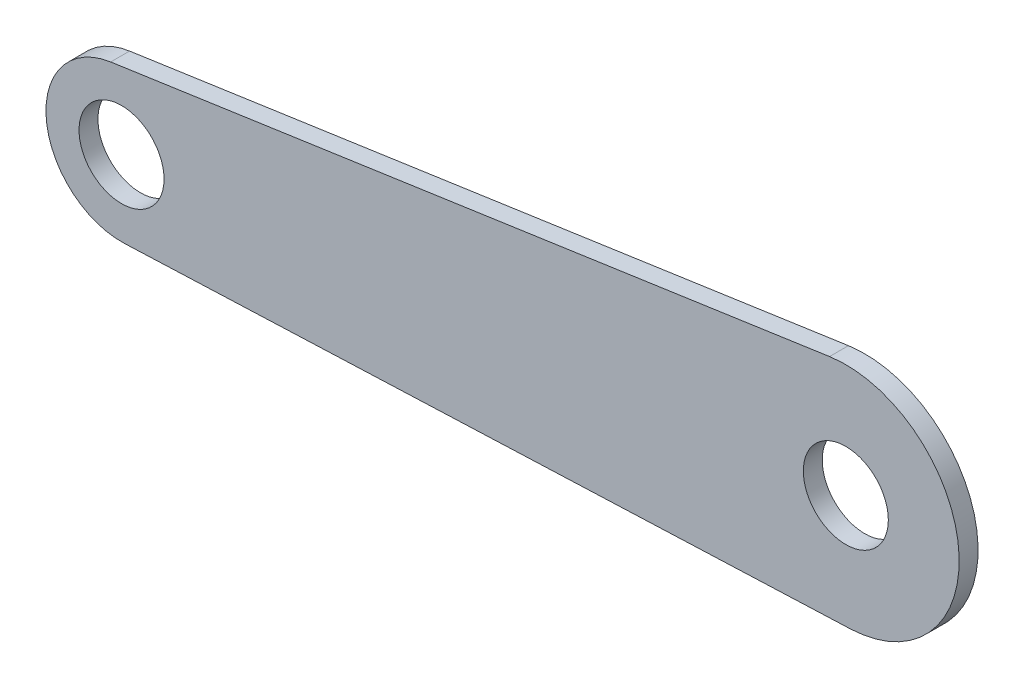
ISO-10303-21;
HEADER;
FILE_DESCRIPTION(('STEP AP214'),'2;1');
FILE_NAME('part.step','',(''),(''),'','','');
FILE_SCHEMA(('AUTOMOTIVE_DESIGN { 1 0 10303 214 1 1 1 1 }'));
ENDSEC;
DATA;
#1=APPLICATION_CONTEXT('core data for automotive mechanical design processes');
#2=APPLICATION_PROTOCOL_DEFINITION('international standard','automotive_design',2000,#1);
#3=PRODUCT_CONTEXT('',#1,'mechanical');
#4=PRODUCT('Part','Part','',(#3));
#5=PRODUCT_RELATED_PRODUCT_CATEGORY('part','',(#4));
#6=PRODUCT_DEFINITION_FORMATION('','',#4);
#7=PRODUCT_DEFINITION_CONTEXT('part definition',#1,'design');
#8=PRODUCT_DEFINITION('design','',#6,#7);
#9=PRODUCT_DEFINITION_SHAPE('','',#8);
#10=(LENGTH_UNIT() NAMED_UNIT(*) SI_UNIT(.MILLI.,.METRE.));
#11=(NAMED_UNIT(*) PLANE_ANGLE_UNIT() SI_UNIT($,.RADIAN.));
#12=(NAMED_UNIT(*) SI_UNIT($,.STERADIAN.) SOLID_ANGLE_UNIT());
#13=UNCERTAINTY_MEASURE_WITH_UNIT(LENGTH_MEASURE(1.E-05),#10,'distance_accuracy_value','');
#14=(GEOMETRIC_REPRESENTATION_CONTEXT(3) GLOBAL_UNCERTAINTY_ASSIGNED_CONTEXT((#13)) GLOBAL_UNIT_ASSIGNED_CONTEXT((#10,
#11,#12)) REPRESENTATION_CONTEXT('',''));
#15=CARTESIAN_POINT('',(0.,0.,0.));
#16=DIRECTION('',(0.,0.,1.));
#17=DIRECTION('',(1.,0.,0.));
#18=AXIS2_PLACEMENT_3D('',#15,#16,#17);
#19=CARTESIAN_POINT('',(158.75,246.126,6.35));
#20=DIRECTION('',(0.,0.,-1.));
#21=DIRECTION('',(-1.,0.,0.));
#22=AXIS2_PLACEMENT_3D('',#19,#20,#21);
#23=CYLINDRICAL_SURFACE('',#22,38.1000000000001);
#24=CARTESIAN_POINT('',(158.75,246.126,0.));
#25=DIRECTION('',(0.,0.,1.));
#26=DIRECTION('',(1.,0.,0.));
#27=AXIS2_PLACEMENT_3D('',#24,#25,#26);
#28=CIRCLE('',#27,38.1000000000001);
#29=CARTESIAN_POINT('',(160.278782763725,208.056683966463,0.));
#30=VERTEX_POINT('',#29);
#31=CARTESIAN_POINT('',(153.279443351109,283.831211973297,0.));
#32=VERTEX_POINT('',#31);
#33=EDGE_CURVE('E114',#30,#32,#28,.T.);
#34=ORIENTED_EDGE('',*,*,#33,.T.);
#35=DIRECTION('',(0.,0.,-1.));
#36=VECTOR('',#35,1.);
#37=CARTESIAN_POINT('',(153.279443351109,283.831211973297,6.35));
#38=LINE('',#37,#36);
#39=CARTESIAN_POINT('',(153.279443351109,283.831211973297,6.35));
#40=VERTEX_POINT('',#39);
#41=EDGE_CURVE('E11',#40,#32,#38,.T.);
#42=ORIENTED_EDGE('',*,*,#41,.F.);
#43=CARTESIAN_POINT('',(158.75,246.126,6.35));
#44=DIRECTION('',(0.,0.,1.));
#45=DIRECTION('',(1.,0.,0.));
#46=AXIS2_PLACEMENT_3D('',#43,#44,#45);
#47=CIRCLE('',#46,38.1000000000001);
#48=CARTESIAN_POINT('',(160.278782763725,208.056683966463,6.35));
#49=VERTEX_POINT('',#48);
#50=EDGE_CURVE('E84',#49,#40,#47,.T.);
#51=ORIENTED_EDGE('',*,*,#50,.F.);
#52=DIRECTION('',(0.,0.,-1.));
#53=VECTOR('',#52,1.);
#54=CARTESIAN_POINT('',(160.278782763725,208.056683966463,6.35));
#55=LINE('',#54,#53);
#56=EDGE_CURVE('E110',#49,#30,#55,.T.);
#57=ORIENTED_EDGE('',*,*,#56,.T.);
#58=EDGE_LOOP('',(#34,#42,#51,#57));
#59=FACE_BOUND('',#58,.T.);
#60=ADVANCED_FACE('F41',(#59),#23,.T.);
#61=CARTESIAN_POINT('',(-37.1713100763805,256.199179664689,6.35));
#62=DIRECTION('',(-0.143584164012887,0.98963810953536,0.));
#63=DIRECTION('',(-0.98963810953536,-0.143584164012887,0.));
#64=AXIS2_PLACEMENT_3D('',#61,#62,#63);
#65=PLANE('',#64);
#66=DIRECTION('',(0.98963810953536,0.143584164012887,0.));
#67=VECTOR('',#66,1.);
#68=CARTESIAN_POINT('',(-37.1713100763805,256.199179664689,0.));
#69=LINE('',#68,#67);
#70=CARTESIAN_POINT('',(-88.3287533566649,248.776871797135,0.));
#71=VERTEX_POINT('',#70);
#72=EDGE_CURVE('E94',#71,#32,#69,.T.);
#73=ORIENTED_EDGE('',*,*,#72,.F.);
#74=DIRECTION('',(0.,0.,-1.));
#75=VECTOR('',#74,1.);
#76=CARTESIAN_POINT('',(-88.3287533566649,248.776871797135,6.35));
#77=LINE('',#76,#75);
#78=CARTESIAN_POINT('',(-88.3287533566649,248.776871797135,6.35));
#79=VERTEX_POINT('',#78);
#80=EDGE_CURVE('E50',#79,#71,#77,.T.);
#81=ORIENTED_EDGE('',*,*,#80,.F.);
#82=DIRECTION('',(0.98963810953536,0.143584164012887,0.));
#83=VECTOR('',#82,1.);
#84=CARTESIAN_POINT('',(-37.1713100763805,256.199179664689,6.35));
#85=LINE('',#84,#83);
#86=EDGE_CURVE('E92',#79,#40,#85,.T.);
#87=ORIENTED_EDGE('',*,*,#86,.T.);
#88=ORIENTED_EDGE('',*,*,#41,.T.);
#89=EDGE_LOOP('',(#73,#81,#87,#88));
#90=FACE_BOUND('',#89,.T.);
#91=ADVANCED_FACE('F91',(#90),#65,.T.);
#92=CARTESIAN_POINT('',(-84.6817155907376,223.640063814937,6.35));
#93=DIRECTION('',(0.,0.,-1.));
#94=DIRECTION('',(-1.,0.,0.));
#95=AXIS2_PLACEMENT_3D('',#92,#93,#94);
#96=CYLINDRICAL_SURFACE('',#95,25.4);
#97=CARTESIAN_POINT('',(-84.6817155907376,223.640063814937,0.));
#98=DIRECTION('',(0.,0.,1.));
#99=DIRECTION('',(1.,0.,0.));
#100=AXIS2_PLACEMENT_3D('',#97,#98,#99);
#101=CIRCLE('',#100,25.4);
#102=CARTESIAN_POINT('',(-83.6625270815875,198.260519792578,0.));
#103=VERTEX_POINT('',#102);
#104=EDGE_CURVE('E73',#71,#103,#101,.T.);
#105=ORIENTED_EDGE('',*,*,#104,.T.);
#106=DIRECTION('',(0.,0.,-1.));
#107=VECTOR('',#106,1.);
#108=CARTESIAN_POINT('',(-83.6625270815875,198.260519792578,6.35));
#109=LINE('',#108,#107);
#110=CARTESIAN_POINT('',(-83.6625270815875,198.260519792578,6.35));
#111=VERTEX_POINT('',#110);
#112=EDGE_CURVE('E95',#111,#103,#109,.T.);
#113=ORIENTED_EDGE('',*,*,#112,.F.);
#114=CARTESIAN_POINT('',(-84.6817155907376,223.640063814937,6.35));
#115=DIRECTION('',(0.,0.,1.));
#116=DIRECTION('',(1.,0.,0.));
#117=AXIS2_PLACEMENT_3D('',#114,#115,#116);
#118=CIRCLE('',#117,25.4);
#119=EDGE_CURVE('E96',#79,#111,#118,.T.);
#120=ORIENTED_EDGE('',*,*,#119,.F.);
#121=ORIENTED_EDGE('',*,*,#80,.T.);
#122=EDGE_LOOP('',(#105,#113,#120,#121));
#123=FACE_BOUND('',#122,.T.);
#124=ADVANCED_FACE('F97',(#123),#96,.T.);
#125=CARTESIAN_POINT('',(-8.08360351408128,201.295608617109,6.35));
#126=DIRECTION('',(-0.0401255318562997,0.999194646549534,0.));
#127=DIRECTION('',(-0.999194646549534,-0.0401255318562997,0.));
#128=AXIS2_PLACEMENT_3D('',#125,#126,#127);
#129=PLANE('',#128);
#130=DIRECTION('',(0.999194646549534,0.0401255318562997,0.));
#131=VECTOR('',#130,1.);
#132=CARTESIAN_POINT('',(-8.08360351408128,201.295608617109,0.));
#133=LINE('',#132,#131);
#134=EDGE_CURVE('E79',#103,#30,#133,.T.);
#135=ORIENTED_EDGE('',*,*,#134,.T.);
#136=ORIENTED_EDGE('',*,*,#56,.F.);
#137=DIRECTION('',(0.999194646549534,0.0401255318562997,0.));
#138=VECTOR('',#137,1.);
#139=CARTESIAN_POINT('',(-8.08360351408128,201.295608617109,6.35));
#140=LINE('',#139,#138);
#141=EDGE_CURVE('E58',#111,#49,#140,.T.);
#142=ORIENTED_EDGE('',*,*,#141,.F.);
#143=ORIENTED_EDGE('',*,*,#112,.T.);
#144=EDGE_LOOP('',(#135,#136,#142,#143));
#145=FACE_BOUND('',#144,.T.);
#146=ADVANCED_FACE('F124',(#145),#129,.F.);
#147=CARTESIAN_POINT('',(158.75,246.126,6.35));
#148=DIRECTION('',(0.,0.,-1.));
#149=DIRECTION('',(-1.,0.,0.));
#150=AXIS2_PLACEMENT_3D('',#147,#148,#149);
#151=CYLINDRICAL_SURFACE('',#150,14.2875);
#152=CARTESIAN_POINT('',(158.75,246.126,6.35));
#153=DIRECTION('',(0.,0.,1.));
#154=DIRECTION('',(1.,0.,0.));
#155=AXIS2_PLACEMENT_3D('',#152,#153,#154);
#156=CIRCLE('',#155,14.2875);
#157=CARTESIAN_POINT('',(173.0375,246.126,6.35));
#158=VERTEX_POINT('',#157);
#159=EDGE_CURVE('E102',#158,#158,#156,.T.);
#160=ORIENTED_EDGE('',*,*,#159,.T.);
#161=EDGE_LOOP('',(#160));
#162=FACE_BOUND('',#161,.T.);
#163=CARTESIAN_POINT('',(158.75,246.126,0.));
#164=DIRECTION('',(0.,0.,1.));
#165=DIRECTION('',(1.,0.,0.));
#166=AXIS2_PLACEMENT_3D('',#163,#164,#165);
#167=CIRCLE('',#166,14.2875);
#168=CARTESIAN_POINT('',(173.0375,246.126,0.));
#169=VERTEX_POINT('',#168);
#170=EDGE_CURVE('E111',#169,#169,#167,.T.);
#171=ORIENTED_EDGE('',*,*,#170,.F.);
#172=EDGE_LOOP('',(#171));
#173=FACE_BOUND('',#172,.T.);
#174=ADVANCED_FACE('F43',(#162,#173),#151,.F.);
#175=CARTESIAN_POINT('',(-84.6817155907376,223.640063814937,6.35));
#176=DIRECTION('',(0.,0.,-1.));
#177=DIRECTION('',(-1.,0.,0.));
#178=AXIS2_PLACEMENT_3D('',#175,#176,#177);
#179=CYLINDRICAL_SURFACE('',#178,14.2874999999999);
#180=CARTESIAN_POINT('',(-84.6817155907376,223.640063814937,6.35));
#181=DIRECTION('',(0.,0.,1.));
#182=DIRECTION('',(1.,0.,0.));
#183=AXIS2_PLACEMENT_3D('',#180,#181,#182);
#184=CIRCLE('',#183,14.2874999999999);
#185=CARTESIAN_POINT('',(-70.3942155907376,223.640063814937,6.35));
#186=VERTEX_POINT('',#185);
#187=EDGE_CURVE('E107',#186,#186,#184,.T.);
#188=ORIENTED_EDGE('',*,*,#187,.T.);
#189=EDGE_LOOP('',(#188));
#190=FACE_BOUND('',#189,.T.);
#191=CARTESIAN_POINT('',(-84.6817155907376,223.640063814937,0.));
#192=DIRECTION('',(0.,0.,1.));
#193=DIRECTION('',(1.,0.,0.));
#194=AXIS2_PLACEMENT_3D('',#191,#192,#193);
#195=CIRCLE('',#194,14.2874999999999);
#196=CARTESIAN_POINT('',(-70.3942155907376,223.640063814937,0.));
#197=VERTEX_POINT('',#196);
#198=EDGE_CURVE('E120',#197,#197,#195,.T.);
#199=ORIENTED_EDGE('',*,*,#198,.F.);
#200=EDGE_LOOP('',(#199));
#201=FACE_BOUND('',#200,.T.);
#202=ADVANCED_FACE('F140',(#190,#201),#179,.F.);
#203=CARTESIAN_POINT('',(0.,0.,6.35));
#204=DIRECTION('',(0.,0.,1.));
#205=DIRECTION('',(1.,0.,0.));
#206=AXIS2_PLACEMENT_3D('',#203,#204,#205);
#207=PLANE('',#206);
#208=ORIENTED_EDGE('',*,*,#159,.F.);
#209=EDGE_LOOP('',(#208));
#210=FACE_BOUND('',#209,.T.);
#211=ORIENTED_EDGE('',*,*,#50,.T.);
#212=ORIENTED_EDGE('',*,*,#86,.F.);
#213=ORIENTED_EDGE('',*,*,#119,.T.);
#214=ORIENTED_EDGE('',*,*,#141,.T.);
#215=EDGE_LOOP('',(#211,#212,#213,#214));
#216=FACE_BOUND('',#215,.T.);
#217=ORIENTED_EDGE('',*,*,#187,.F.);
#218=EDGE_LOOP('',(#217));
#219=FACE_BOUND('',#218,.T.);
#220=ADVANCED_FACE('F99',(#210,#216,#219),#207,.T.);
#221=CARTESIAN_POINT('',(0.,0.,0.));
#222=DIRECTION('',(0.,0.,1.));
#223=DIRECTION('',(1.,0.,0.));
#224=AXIS2_PLACEMENT_3D('',#221,#222,#223);
#225=PLANE('',#224);
#226=ORIENTED_EDGE('',*,*,#170,.T.);
#227=EDGE_LOOP('',(#226));
#228=FACE_BOUND('',#227,.T.);
#229=ORIENTED_EDGE('',*,*,#33,.F.);
#230=ORIENTED_EDGE('',*,*,#134,.F.);
#231=ORIENTED_EDGE('',*,*,#104,.F.);
#232=ORIENTED_EDGE('',*,*,#72,.T.);
#233=EDGE_LOOP('',(#229,#230,#231,#232));
#234=FACE_BOUND('',#233,.T.);
#235=ORIENTED_EDGE('',*,*,#198,.T.);
#236=EDGE_LOOP('',(#235));
#237=FACE_BOUND('',#236,.T.);
#238=ADVANCED_FACE('F127',(#228,#234,#237),#225,.F.);
#239=CLOSED_SHELL('',(#60,#91,#124,#146,#174,#202,#220,#238));
#240=MANIFOLD_SOLID_BREP('B2',#239);
#241=ADVANCED_BREP_SHAPE_REPRESENTATION('',(#18,#240),#14);
#242=SHAPE_DEFINITION_REPRESENTATION(#9,#241);
ENDSEC;
END-ISO-10303-21;
